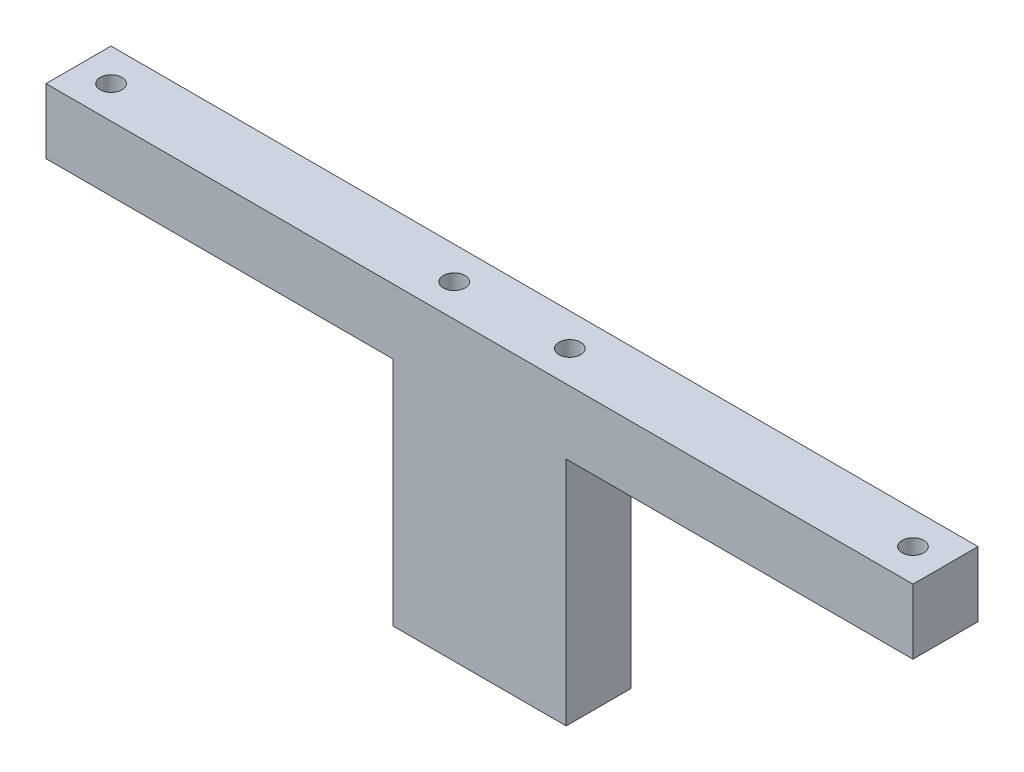
ISO-10303-21;
HEADER;
FILE_DESCRIPTION(('STEP AP214'),'2;1');
FILE_NAME('part.step','',(''),(''),'','','');
FILE_SCHEMA(('AUTOMOTIVE_DESIGN { 1 0 10303 214 1 1 1 1 }'));
ENDSEC;
DATA;
#1=APPLICATION_CONTEXT('core data for automotive mechanical design processes');
#2=APPLICATION_PROTOCOL_DEFINITION('international standard','automotive_design',2000,#1);
#3=PRODUCT_CONTEXT('',#1,'mechanical');
#4=PRODUCT('Part','Part','',(#3));
#5=PRODUCT_RELATED_PRODUCT_CATEGORY('part','',(#4));
#6=PRODUCT_DEFINITION_FORMATION('','',#4);
#7=PRODUCT_DEFINITION_CONTEXT('part definition',#1,'design');
#8=PRODUCT_DEFINITION('design','',#6,#7);
#9=PRODUCT_DEFINITION_SHAPE('','',#8);
#10=(LENGTH_UNIT() NAMED_UNIT(*) SI_UNIT(.MILLI.,.METRE.));
#11=(NAMED_UNIT(*) PLANE_ANGLE_UNIT() SI_UNIT($,.RADIAN.));
#12=(NAMED_UNIT(*) SI_UNIT($,.STERADIAN.) SOLID_ANGLE_UNIT());
#13=UNCERTAINTY_MEASURE_WITH_UNIT(LENGTH_MEASURE(1.E-05),#10,'distance_accuracy_value','');
#14=(GEOMETRIC_REPRESENTATION_CONTEXT(3) GLOBAL_UNCERTAINTY_ASSIGNED_CONTEXT((#13)) GLOBAL_UNIT_ASSIGNED_CONTEXT((#10,
#11,#12)) REPRESENTATION_CONTEXT('',''));
#15=CARTESIAN_POINT('',(0.,0.,0.));
#16=DIRECTION('',(0.,0.,1.));
#17=DIRECTION('',(1.,0.,0.));
#18=AXIS2_PLACEMENT_3D('',#15,#16,#17);
#19=CARTESIAN_POINT('',(190.5,0.,28.575));
#20=DIRECTION('',(1.,0.,0.));
#21=DIRECTION('',(0.,0.,-1.));
#22=AXIS2_PLACEMENT_3D('',#19,#20,#21);
#23=PLANE('',#22);
#24=DIRECTION('',(0.,-1.,0.));
#25=VECTOR('',#24,1.);
#26=CARTESIAN_POINT('',(190.5,0.,0.));
#27=LINE('',#26,#25);
#28=CARTESIAN_POINT('',(190.5,0.,0.));
#29=VERTEX_POINT('',#28);
#30=CARTESIAN_POINT('',(190.5,-28.575,0.));
#31=VERTEX_POINT('',#30);
#32=EDGE_CURVE('E130',#29,#31,#27,.T.);
#33=ORIENTED_EDGE('',*,*,#32,.F.);
#34=DIRECTION('',(0.,0.,-1.));
#35=VECTOR('',#34,1.);
#36=CARTESIAN_POINT('',(190.5,0.,28.575));
#37=LINE('',#36,#35);
#38=CARTESIAN_POINT('',(190.5,0.,28.575));
#39=VERTEX_POINT('',#38);
#40=EDGE_CURVE('E11',#39,#29,#37,.T.);
#41=ORIENTED_EDGE('',*,*,#40,.F.);
#42=DIRECTION('',(0.,-1.,0.));
#43=VECTOR('',#42,1.);
#44=CARTESIAN_POINT('',(190.5,0.,28.575));
#45=LINE('',#44,#43);
#46=CARTESIAN_POINT('',(190.5,-28.575,28.575));
#47=VERTEX_POINT('',#46);
#48=EDGE_CURVE('E170',#39,#47,#45,.T.);
#49=ORIENTED_EDGE('',*,*,#48,.T.);
#50=DIRECTION('',(0.,0.,-1.));
#51=VECTOR('',#50,1.);
#52=CARTESIAN_POINT('',(190.5,-28.575,28.575));
#53=LINE('',#52,#51);
#54=EDGE_CURVE('E86',#47,#31,#53,.T.);
#55=ORIENTED_EDGE('',*,*,#54,.T.);
#56=EDGE_LOOP('',(#33,#41,#49,#55));
#57=FACE_BOUND('',#56,.T.);
#58=ADVANCED_FACE('F34',(#57),#23,.T.);
#59=CARTESIAN_POINT('',(0.,0.,28.575));
#60=DIRECTION('',(0.,1.,0.));
#61=DIRECTION('',(0.,0.,1.));
#62=AXIS2_PLACEMENT_3D('',#59,#60,#61);
#63=PLANE('',#62);
#64=CARTESIAN_POINT('',(-25.4,0.,14.2875));
#65=DIRECTION('',(0.,1.,0.));
#66=DIRECTION('',(0.,0.,1.));
#67=AXIS2_PLACEMENT_3D('',#64,#65,#66);
#68=CIRCLE('',#67,4.7625);
#69=CARTESIAN_POINT('',(-25.4,0.,19.05));
#70=VERTEX_POINT('',#69);
#71=EDGE_CURVE('E330',#70,#70,#68,.T.);
#72=ORIENTED_EDGE('',*,*,#71,.F.);
#73=EDGE_LOOP('',(#72));
#74=FACE_BOUND('',#73,.T.);
#75=CARTESIAN_POINT('',(25.4,0.,14.2875));
#76=DIRECTION('',(0.,1.,0.));
#77=DIRECTION('',(0.,0.,-1.));
#78=AXIS2_PLACEMENT_3D('',#75,#76,#77);
#79=CIRCLE('',#78,4.7625);
#80=CARTESIAN_POINT('',(25.4,0.,9.525));
#81=VERTEX_POINT('',#80);
#82=EDGE_CURVE('E335',#81,#81,#79,.T.);
#83=ORIENTED_EDGE('',*,*,#82,.F.);
#84=EDGE_LOOP('',(#83));
#85=FACE_BOUND('',#84,.T.);
#86=CARTESIAN_POINT('',(176.2125,0.,14.2875));
#87=DIRECTION('',(0.,1.,0.));
#88=DIRECTION('',(0.,0.,-1.));
#89=AXIS2_PLACEMENT_3D('',#86,#87,#88);
#90=CIRCLE('',#89,4.76250000000001);
#91=CARTESIAN_POINT('',(176.2125,0.,9.52499999999999));
#92=VERTEX_POINT('',#91);
#93=EDGE_CURVE('E168',#92,#92,#90,.T.);
#94=ORIENTED_EDGE('',*,*,#93,.F.);
#95=EDGE_LOOP('',(#94));
#96=FACE_BOUND('',#95,.T.);
#97=CARTESIAN_POINT('',(-176.2125,0.,14.2875));
#98=DIRECTION('',(0.,1.,0.));
#99=DIRECTION('',(0.,0.,1.));
#100=AXIS2_PLACEMENT_3D('',#97,#98,#99);
#101=CIRCLE('',#100,4.76250000000001);
#102=CARTESIAN_POINT('',(-176.2125,0.,19.05));
#103=VERTEX_POINT('',#102);
#104=EDGE_CURVE('E157',#103,#103,#101,.T.);
#105=ORIENTED_EDGE('',*,*,#104,.F.);
#106=EDGE_LOOP('',(#105));
#107=FACE_BOUND('',#106,.T.);
#108=DIRECTION('',(1.,0.,0.));
#109=VECTOR('',#108,1.);
#110=CARTESIAN_POINT('',(0.,0.,0.));
#111=LINE('',#110,#109);
#112=CARTESIAN_POINT('',(-190.5,0.,0.));
#113=VERTEX_POINT('',#112);
#114=EDGE_CURVE('E133',#113,#29,#111,.T.);
#115=ORIENTED_EDGE('',*,*,#114,.F.);
#116=DIRECTION('',(0.,0.,-1.));
#117=VECTOR('',#116,1.);
#118=CARTESIAN_POINT('',(-190.5,0.,28.575));
#119=LINE('',#118,#117);
#120=CARTESIAN_POINT('',(-190.5,0.,28.575));
#121=VERTEX_POINT('',#120);
#122=EDGE_CURVE('E43',#121,#113,#119,.T.);
#123=ORIENTED_EDGE('',*,*,#122,.F.);
#124=DIRECTION('',(1.,0.,0.));
#125=VECTOR('',#124,1.);
#126=CARTESIAN_POINT('',(0.,0.,28.575));
#127=LINE('',#126,#125);
#128=EDGE_CURVE('E172',#121,#39,#127,.T.);
#129=ORIENTED_EDGE('',*,*,#128,.T.);
#130=ORIENTED_EDGE('',*,*,#40,.T.);
#131=EDGE_LOOP('',(#115,#123,#129,#130));
#132=FACE_BOUND('',#131,.T.);
#133=ADVANCED_FACE('F192',(#74,#85,#96,#107,#132),#63,.T.);
#134=CARTESIAN_POINT('',(-190.5,0.,28.575));
#135=DIRECTION('',(1.,0.,0.));
#136=DIRECTION('',(0.,0.,-1.));
#137=AXIS2_PLACEMENT_3D('',#134,#135,#136);
#138=PLANE('',#137);
#139=DIRECTION('',(0.,-1.,0.));
#140=VECTOR('',#139,1.);
#141=CARTESIAN_POINT('',(-190.5,0.,0.));
#142=LINE('',#141,#140);
#143=CARTESIAN_POINT('',(-190.5,-28.575,0.));
#144=VERTEX_POINT('',#143);
#145=EDGE_CURVE('E137',#113,#144,#142,.T.);
#146=ORIENTED_EDGE('',*,*,#145,.T.);
#147=DIRECTION('',(0.,0.,-1.));
#148=VECTOR('',#147,1.);
#149=CARTESIAN_POINT('',(-190.5,-28.575,28.575));
#150=LINE('',#149,#148);
#151=CARTESIAN_POINT('',(-190.5,-28.575,28.575));
#152=VERTEX_POINT('',#151);
#153=EDGE_CURVE('E153',#152,#144,#150,.T.);
#154=ORIENTED_EDGE('',*,*,#153,.F.);
#155=DIRECTION('',(0.,-1.,0.));
#156=VECTOR('',#155,1.);
#157=CARTESIAN_POINT('',(-190.5,0.,28.575));
#158=LINE('',#157,#156);
#159=EDGE_CURVE('E175',#121,#152,#158,.T.);
#160=ORIENTED_EDGE('',*,*,#159,.F.);
#161=ORIENTED_EDGE('',*,*,#122,.T.);
#162=EDGE_LOOP('',(#146,#154,#160,#161));
#163=FACE_BOUND('',#162,.T.);
#164=ADVANCED_FACE('F195',(#163),#138,.F.);
#165=CARTESIAN_POINT('',(0.,-28.575,28.575));
#166=DIRECTION('',(0.,1.,0.));
#167=DIRECTION('',(0.,0.,1.));
#168=AXIS2_PLACEMENT_3D('',#165,#166,#167);
#169=PLANE('',#168);
#170=CARTESIAN_POINT('',(-176.2125,-28.575,14.2875));
#171=DIRECTION('',(0.,1.,0.));
#172=DIRECTION('',(0.,0.,1.));
#173=AXIS2_PLACEMENT_3D('',#170,#171,#172);
#174=CIRCLE('',#173,4.76250000000001);
#175=CARTESIAN_POINT('',(-176.2125,-28.575,19.05));
#176=VERTEX_POINT('',#175);
#177=EDGE_CURVE('E134',#176,#176,#174,.T.);
#178=ORIENTED_EDGE('',*,*,#177,.T.);
#179=EDGE_LOOP('',(#178));
#180=FACE_BOUND('',#179,.T.);
#181=DIRECTION('',(1.,0.,0.));
#182=VECTOR('',#181,1.);
#183=CARTESIAN_POINT('',(0.,-28.575,0.));
#184=LINE('',#183,#182);
#185=CARTESIAN_POINT('',(-38.1,-28.575,0.));
#186=VERTEX_POINT('',#185);
#187=EDGE_CURVE('E139',#144,#186,#184,.T.);
#188=ORIENTED_EDGE('',*,*,#187,.T.);
#189=DIRECTION('',(0.,0.,-1.));
#190=VECTOR('',#189,1.);
#191=CARTESIAN_POINT('',(-38.1,-28.575,28.575));
#192=LINE('',#191,#190);
#193=CARTESIAN_POINT('',(-38.1,-28.575,28.575));
#194=VERTEX_POINT('',#193);
#195=EDGE_CURVE('E150',#194,#186,#192,.T.);
#196=ORIENTED_EDGE('',*,*,#195,.F.);
#197=DIRECTION('',(1.,0.,0.));
#198=VECTOR('',#197,1.);
#199=CARTESIAN_POINT('',(0.,-28.575,28.575));
#200=LINE('',#199,#198);
#201=EDGE_CURVE('E127',#152,#194,#200,.T.);
#202=ORIENTED_EDGE('',*,*,#201,.F.);
#203=ORIENTED_EDGE('',*,*,#153,.T.);
#204=EDGE_LOOP('',(#188,#196,#202,#203));
#205=FACE_BOUND('',#204,.T.);
#206=ADVANCED_FACE('F182',(#180,#205),#169,.F.);
#207=CARTESIAN_POINT('',(-38.1,0.,28.575));
#208=DIRECTION('',(1.,0.,0.));
#209=DIRECTION('',(0.,1.,0.));
#210=AXIS2_PLACEMENT_3D('',#207,#208,#209);
#211=PLANE('',#210);
#212=DIRECTION('',(0.,-1.,0.));
#213=VECTOR('',#212,1.);
#214=CARTESIAN_POINT('',(-38.1,0.,0.));
#215=LINE('',#214,#213);
#216=CARTESIAN_POINT('',(-38.1,-130.175,0.));
#217=VERTEX_POINT('',#216);
#218=EDGE_CURVE('E141',#186,#217,#215,.T.);
#219=ORIENTED_EDGE('',*,*,#218,.T.);
#220=DIRECTION('',(0.,0.,-1.));
#221=VECTOR('',#220,1.);
#222=CARTESIAN_POINT('',(-38.1,-130.175,28.575));
#223=LINE('',#222,#221);
#224=CARTESIAN_POINT('',(-38.1,-130.175,28.575));
#225=VERTEX_POINT('',#224);
#226=EDGE_CURVE('E122',#225,#217,#223,.T.);
#227=ORIENTED_EDGE('',*,*,#226,.F.);
#228=DIRECTION('',(0.,-1.,0.));
#229=VECTOR('',#228,1.);
#230=CARTESIAN_POINT('',(-38.1,0.,28.575));
#231=LINE('',#230,#229);
#232=EDGE_CURVE('E109',#194,#225,#231,.T.);
#233=ORIENTED_EDGE('',*,*,#232,.F.);
#234=ORIENTED_EDGE('',*,*,#195,.T.);
#235=EDGE_LOOP('',(#219,#227,#233,#234));
#236=FACE_BOUND('',#235,.T.);
#237=ADVANCED_FACE('F186',(#236),#211,.F.);
#238=CARTESIAN_POINT('',(0.,-130.175,28.575));
#239=DIRECTION('',(0.,1.,0.));
#240=DIRECTION('',(0.,0.,1.));
#241=AXIS2_PLACEMENT_3D('',#238,#239,#240);
#242=PLANE('',#241);
#243=CARTESIAN_POINT('',(-25.4,-130.175,14.2875));
#244=DIRECTION('',(0.,1.,0.));
#245=DIRECTION('',(0.,0.,1.));
#246=AXIS2_PLACEMENT_3D('',#243,#244,#245);
#247=CIRCLE('',#246,4.7625);
#248=CARTESIAN_POINT('',(-25.4,-130.175,19.05));
#249=VERTEX_POINT('',#248);
#250=EDGE_CURVE('E165',#249,#249,#247,.T.);
#251=ORIENTED_EDGE('',*,*,#250,.T.);
#252=EDGE_LOOP('',(#251));
#253=FACE_BOUND('',#252,.T.);
#254=CARTESIAN_POINT('',(25.4,-130.175,14.2875));
#255=DIRECTION('',(0.,1.,0.));
#256=DIRECTION('',(0.,0.,-1.));
#257=AXIS2_PLACEMENT_3D('',#254,#255,#256);
#258=CIRCLE('',#257,4.7625);
#259=CARTESIAN_POINT('',(25.4,-130.175,9.525));
#260=VERTEX_POINT('',#259);
#261=EDGE_CURVE('E331',#260,#260,#258,.T.);
#262=ORIENTED_EDGE('',*,*,#261,.T.);
#263=EDGE_LOOP('',(#262));
#264=FACE_BOUND('',#263,.T.);
#265=DIRECTION('',(1.,0.,0.));
#266=VECTOR('',#265,1.);
#267=CARTESIAN_POINT('',(0.,-130.175,0.));
#268=LINE('',#267,#266);
#269=CARTESIAN_POINT('',(38.1,-130.175,0.));
#270=VERTEX_POINT('',#269);
#271=EDGE_CURVE('E118',#217,#270,#268,.T.);
#272=ORIENTED_EDGE('',*,*,#271,.T.);
#273=DIRECTION('',(0.,0.,-1.));
#274=VECTOR('',#273,1.);
#275=CARTESIAN_POINT('',(38.1,-130.175,28.575));
#276=LINE('',#275,#274);
#277=CARTESIAN_POINT('',(38.1,-130.175,28.575));
#278=VERTEX_POINT('',#277);
#279=EDGE_CURVE('E115',#278,#270,#276,.T.);
#280=ORIENTED_EDGE('',*,*,#279,.F.);
#281=DIRECTION('',(1.,0.,0.));
#282=VECTOR('',#281,1.);
#283=CARTESIAN_POINT('',(0.,-130.175,28.575));
#284=LINE('',#283,#282);
#285=EDGE_CURVE('E103',#225,#278,#284,.T.);
#286=ORIENTED_EDGE('',*,*,#285,.F.);
#287=ORIENTED_EDGE('',*,*,#226,.T.);
#288=EDGE_LOOP('',(#272,#280,#286,#287));
#289=FACE_BOUND('',#288,.T.);
#290=ADVANCED_FACE('F116',(#253,#264,#289),#242,.F.);
#291=CARTESIAN_POINT('',(38.1,0.,28.575));
#292=DIRECTION('',(1.,0.,0.));
#293=DIRECTION('',(0.,1.,0.));
#294=AXIS2_PLACEMENT_3D('',#291,#292,#293);
#295=PLANE('',#294);
#296=DIRECTION('',(0.,-1.,0.));
#297=VECTOR('',#296,1.);
#298=CARTESIAN_POINT('',(38.1,0.,0.));
#299=LINE('',#298,#297);
#300=CARTESIAN_POINT('',(38.1,-28.575,0.));
#301=VERTEX_POINT('',#300);
#302=EDGE_CURVE('E145',#301,#270,#299,.T.);
#303=ORIENTED_EDGE('',*,*,#302,.F.);
#304=DIRECTION('',(0.,0.,-1.));
#305=VECTOR('',#304,1.);
#306=CARTESIAN_POINT('',(38.1,-28.575,28.575));
#307=LINE('',#306,#305);
#308=CARTESIAN_POINT('',(38.1,-28.575,28.575));
#309=VERTEX_POINT('',#308);
#310=EDGE_CURVE('E79',#309,#301,#307,.T.);
#311=ORIENTED_EDGE('',*,*,#310,.F.);
#312=DIRECTION('',(0.,-1.,0.));
#313=VECTOR('',#312,1.);
#314=CARTESIAN_POINT('',(38.1,0.,28.575));
#315=LINE('',#314,#313);
#316=EDGE_CURVE('E107',#309,#278,#315,.T.);
#317=ORIENTED_EDGE('',*,*,#316,.T.);
#318=ORIENTED_EDGE('',*,*,#279,.T.);
#319=EDGE_LOOP('',(#303,#311,#317,#318));
#320=FACE_BOUND('',#319,.T.);
#321=ADVANCED_FACE('F124',(#320),#295,.T.);
#322=CARTESIAN_POINT('',(176.2125,-28.575,14.2875));
#323=DIRECTION('',(0.,1.,0.));
#324=DIRECTION('',(0.,0.,1.));
#325=AXIS2_PLACEMENT_3D('',#322,#323,#324);
#326=CIRCLE('',#325,4.76250000000001);
#327=CARTESIAN_POINT('',(176.2125,-28.575,19.05));
#328=VERTEX_POINT('',#327);
#329=EDGE_CURVE('E37',#328,#328,#326,.T.);
#330=ORIENTED_EDGE('',*,*,#329,.T.);
#331=EDGE_LOOP('',(#330));
#332=FACE_BOUND('',#331,.T.);
#333=EDGE_CURVE('E142',#301,#31,#184,.T.);
#334=ORIENTED_EDGE('',*,*,#333,.T.);
#335=ORIENTED_EDGE('',*,*,#54,.F.);
#336=EDGE_CURVE('E52',#309,#47,#200,.T.);
#337=ORIENTED_EDGE('',*,*,#336,.F.);
#338=ORIENTED_EDGE('',*,*,#310,.T.);
#339=EDGE_LOOP('',(#334,#335,#337,#338));
#340=FACE_BOUND('',#339,.T.);
#341=ADVANCED_FACE('F189',(#332,#340),#169,.F.);
#342=CARTESIAN_POINT('',(0.,0.,28.575));
#343=DIRECTION('',(0.,0.,1.));
#344=DIRECTION('',(1.,0.,0.));
#345=AXIS2_PLACEMENT_3D('',#342,#343,#344);
#346=PLANE('',#345);
#347=ORIENTED_EDGE('',*,*,#48,.F.);
#348=ORIENTED_EDGE('',*,*,#128,.F.);
#349=ORIENTED_EDGE('',*,*,#159,.T.);
#350=ORIENTED_EDGE('',*,*,#201,.T.);
#351=ORIENTED_EDGE('',*,*,#232,.T.);
#352=ORIENTED_EDGE('',*,*,#285,.T.);
#353=ORIENTED_EDGE('',*,*,#316,.F.);
#354=ORIENTED_EDGE('',*,*,#336,.T.);
#355=EDGE_LOOP('',(#347,#348,#349,#350,#351,#352,#353,#354));
#356=FACE_BOUND('',#355,.T.);
#357=ADVANCED_FACE('F105',(#356),#346,.T.);
#358=CARTESIAN_POINT('',(0.,0.,0.));
#359=DIRECTION('',(0.,0.,1.));
#360=DIRECTION('',(1.,0.,0.));
#361=AXIS2_PLACEMENT_3D('',#358,#359,#360);
#362=PLANE('',#361);
#363=ORIENTED_EDGE('',*,*,#32,.T.);
#364=ORIENTED_EDGE('',*,*,#333,.F.);
#365=ORIENTED_EDGE('',*,*,#302,.T.);
#366=ORIENTED_EDGE('',*,*,#271,.F.);
#367=ORIENTED_EDGE('',*,*,#218,.F.);
#368=ORIENTED_EDGE('',*,*,#187,.F.);
#369=ORIENTED_EDGE('',*,*,#145,.F.);
#370=ORIENTED_EDGE('',*,*,#114,.T.);
#371=EDGE_LOOP('',(#363,#364,#365,#366,#367,#368,#369,#370));
#372=FACE_BOUND('',#371,.T.);
#373=ADVANCED_FACE('F188',(#372),#362,.F.);
#374=CARTESIAN_POINT('',(-176.2125,-130.175,14.2875));
#375=DIRECTION('',(0.,1.,0.));
#376=DIRECTION('',(0.,0.,1.));
#377=AXIS2_PLACEMENT_3D('',#374,#375,#376);
#378=CYLINDRICAL_SURFACE('',#377,4.76250000000001);
#379=ORIENTED_EDGE('',*,*,#104,.T.);
#380=EDGE_LOOP('',(#379));
#381=FACE_BOUND('',#380,.T.);
#382=ORIENTED_EDGE('',*,*,#177,.F.);
#383=EDGE_LOOP('',(#382));
#384=FACE_BOUND('',#383,.T.);
#385=ADVANCED_FACE('F254',(#381,#384),#378,.F.);
#386=CARTESIAN_POINT('',(176.2125,-130.175,14.2875));
#387=DIRECTION('',(0.,1.,0.));
#388=DIRECTION('',(0.,0.,1.));
#389=AXIS2_PLACEMENT_3D('',#386,#387,#388);
#390=CYLINDRICAL_SURFACE('',#389,4.76250000000001);
#391=ORIENTED_EDGE('',*,*,#93,.T.);
#392=EDGE_LOOP('',(#391));
#393=FACE_BOUND('',#392,.T.);
#394=ORIENTED_EDGE('',*,*,#329,.F.);
#395=EDGE_LOOP('',(#394));
#396=FACE_BOUND('',#395,.T.);
#397=ADVANCED_FACE('F259',(#393,#396),#390,.F.);
#398=CARTESIAN_POINT('',(25.4,-130.175,14.2875));
#399=DIRECTION('',(0.,1.,0.));
#400=DIRECTION('',(0.,0.,1.));
#401=AXIS2_PLACEMENT_3D('',#398,#399,#400);
#402=CYLINDRICAL_SURFACE('',#401,4.7625);
#403=ORIENTED_EDGE('',*,*,#261,.F.);
#404=EDGE_LOOP('',(#403));
#405=FACE_BOUND('',#404,.T.);
#406=ORIENTED_EDGE('',*,*,#82,.T.);
#407=EDGE_LOOP('',(#406));
#408=FACE_BOUND('',#407,.T.);
#409=ADVANCED_FACE('F268',(#405,#408),#402,.F.);
#410=CARTESIAN_POINT('',(-25.4,-130.175,14.2875));
#411=DIRECTION('',(0.,1.,0.));
#412=DIRECTION('',(0.,0.,1.));
#413=AXIS2_PLACEMENT_3D('',#410,#411,#412);
#414=CYLINDRICAL_SURFACE('',#413,4.7625);
#415=ORIENTED_EDGE('',*,*,#250,.F.);
#416=EDGE_LOOP('',(#415));
#417=FACE_BOUND('',#416,.T.);
#418=ORIENTED_EDGE('',*,*,#71,.T.);
#419=EDGE_LOOP('',(#418));
#420=FACE_BOUND('',#419,.T.);
#421=ADVANCED_FACE('F278',(#417,#420),#414,.F.);
#422=CLOSED_SHELL('',(#58,#133,#164,#206,#237,#290,#321,#341,#357,#373,#385,#397,#409,#421));
#423=MANIFOLD_SOLID_BREP('B2',#422);
#424=ADVANCED_BREP_SHAPE_REPRESENTATION('',(#18,#423),#14);
#425=SHAPE_DEFINITION_REPRESENTATION(#9,#424);
ENDSEC;
END-ISO-10303-21;
